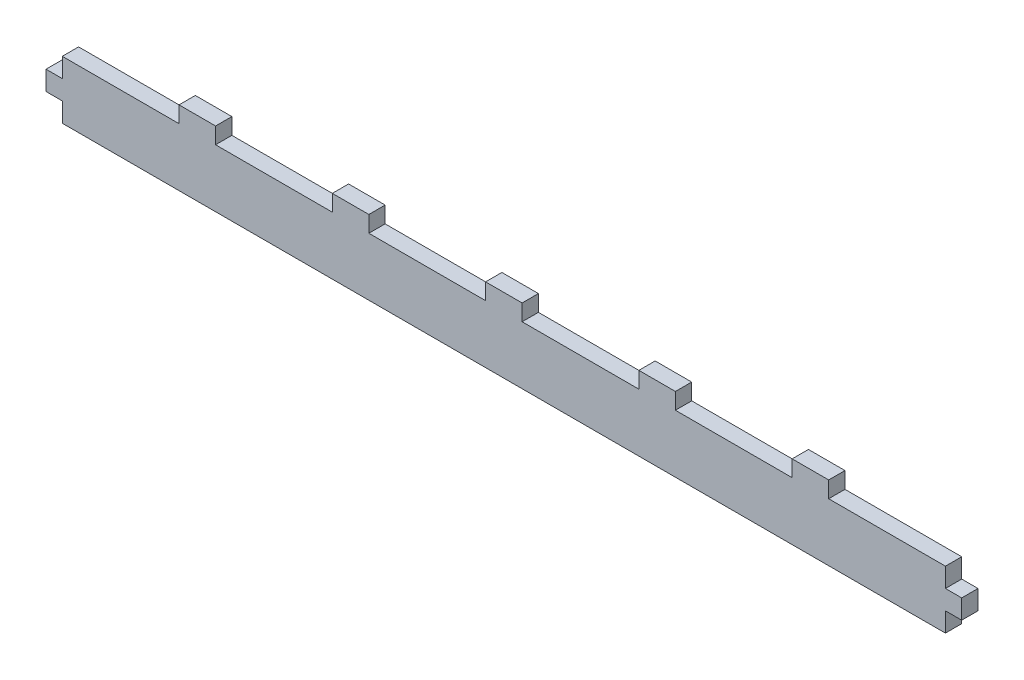
ISO-10303-21;
HEADER;
FILE_DESCRIPTION(('STEP AP214'),'2;1');
FILE_NAME('part.step','',(''),(''),'','','');
FILE_SCHEMA(('AUTOMOTIVE_DESIGN { 1 0 10303 214 1 1 1 1 }'));
ENDSEC;
DATA;
#1=APPLICATION_CONTEXT('core data for automotive mechanical design processes');
#2=APPLICATION_PROTOCOL_DEFINITION('international standard','automotive_design',2000,#1);
#3=PRODUCT_CONTEXT('',#1,'mechanical');
#4=PRODUCT('Part','Part','',(#3));
#5=PRODUCT_RELATED_PRODUCT_CATEGORY('part','',(#4));
#6=PRODUCT_DEFINITION_FORMATION('','',#4);
#7=PRODUCT_DEFINITION_CONTEXT('part definition',#1,'design');
#8=PRODUCT_DEFINITION('design','',#6,#7);
#9=PRODUCT_DEFINITION_SHAPE('','',#8);
#10=(LENGTH_UNIT() NAMED_UNIT(*) SI_UNIT(.MILLI.,.METRE.));
#11=(NAMED_UNIT(*) PLANE_ANGLE_UNIT() SI_UNIT($,.RADIAN.));
#12=(NAMED_UNIT(*) SI_UNIT($,.STERADIAN.) SOLID_ANGLE_UNIT());
#13=UNCERTAINTY_MEASURE_WITH_UNIT(LENGTH_MEASURE(1.E-05),#10,'distance_accuracy_value','');
#14=(GEOMETRIC_REPRESENTATION_CONTEXT(3) GLOBAL_UNCERTAINTY_ASSIGNED_CONTEXT((#13)) GLOBAL_UNIT_ASSIGNED_CONTEXT((#10,
#11,#12)) REPRESENTATION_CONTEXT('',''));
#15=CARTESIAN_POINT('',(0.,0.,0.));
#16=DIRECTION('',(0.,0.,1.));
#17=DIRECTION('',(1.,0.,0.));
#18=AXIS2_PLACEMENT_3D('',#15,#16,#17);
#19=CARTESIAN_POINT('',(-145.,0.,5.35));
#20=DIRECTION('',(1.,0.,0.));
#21=DIRECTION('',(0.,0.,-1.));
#22=AXIS2_PLACEMENT_3D('',#19,#20,#21);
#23=PLANE('',#22);
#24=DIRECTION('',(0.,-1.,0.));
#25=VECTOR('',#24,1.);
#26=CARTESIAN_POINT('',(-145.,0.,0.));
#27=LINE('',#26,#25);
#28=CARTESIAN_POINT('',(-145.,6.35,0.));
#29=VERTEX_POINT('',#28);
#30=CARTESIAN_POINT('',(-145.,0.,0.));
#31=VERTEX_POINT('',#30);
#32=EDGE_CURVE('E272',#29,#31,#27,.T.);
#33=ORIENTED_EDGE('',*,*,#32,.T.);
#34=DIRECTION('',(0.,0.,-1.));
#35=VECTOR('',#34,1.);
#36=CARTESIAN_POINT('',(-145.,0.,5.35));
#37=LINE('',#36,#35);
#38=CARTESIAN_POINT('',(-145.,0.,5.35));
#39=VERTEX_POINT('',#38);
#40=EDGE_CURVE('E11',#39,#31,#37,.T.);
#41=ORIENTED_EDGE('',*,*,#40,.F.);
#42=DIRECTION('',(0.,-1.,0.));
#43=VECTOR('',#42,1.);
#44=CARTESIAN_POINT('',(-145.,0.,5.35));
#45=LINE('',#44,#43);
#46=CARTESIAN_POINT('',(-145.,6.35,5.35));
#47=VERTEX_POINT('',#46);
#48=EDGE_CURVE('E334',#47,#39,#45,.T.);
#49=ORIENTED_EDGE('',*,*,#48,.F.);
#50=DIRECTION('',(0.,0.,-1.));
#51=VECTOR('',#50,1.);
#52=CARTESIAN_POINT('',(-145.,6.35,5.35));
#53=LINE('',#52,#51);
#54=EDGE_CURVE('E268',#47,#29,#53,.T.);
#55=ORIENTED_EDGE('',*,*,#54,.T.);
#56=EDGE_LOOP('',(#33,#41,#49,#55));
#57=FACE_BOUND('',#56,.T.);
#58=ADVANCED_FACE('F32',(#57),#23,.F.);
#59=CARTESIAN_POINT('',(-145.,0.,5.35));
#60=DIRECTION('',(0.,1.,0.));
#61=DIRECTION('',(-1.,0.,0.));
#62=AXIS2_PLACEMENT_3D('',#59,#60,#61);
#63=PLANE('',#62);
#64=DIRECTION('',(1.,0.,0.));
#65=VECTOR('',#64,1.);
#66=CARTESIAN_POINT('',(-145.,0.,0.));
#67=LINE('',#66,#65);
#68=CARTESIAN_POINT('',(145.,0.,0.));
#69=VERTEX_POINT('',#68);
#70=EDGE_CURVE('E275',#31,#69,#67,.T.);
#71=ORIENTED_EDGE('',*,*,#70,.T.);
#72=DIRECTION('',(0.,0.,-1.));
#73=VECTOR('',#72,1.);
#74=CARTESIAN_POINT('',(145.,0.,5.35));
#75=LINE('',#74,#73);
#76=CARTESIAN_POINT('',(145.,0.,5.35));
#77=VERTEX_POINT('',#76);
#78=EDGE_CURVE('E40',#77,#69,#75,.T.);
#79=ORIENTED_EDGE('',*,*,#78,.F.);
#80=DIRECTION('',(1.,0.,0.));
#81=VECTOR('',#80,1.);
#82=CARTESIAN_POINT('',(-145.,0.,5.35));
#83=LINE('',#82,#81);
#84=EDGE_CURVE('E163',#39,#77,#83,.T.);
#85=ORIENTED_EDGE('',*,*,#84,.F.);
#86=ORIENTED_EDGE('',*,*,#40,.T.);
#87=EDGE_LOOP('',(#71,#79,#85,#86));
#88=FACE_BOUND('',#87,.T.);
#89=ADVANCED_FACE('F512',(#88),#63,.F.);
#90=CARTESIAN_POINT('',(145.,0.,5.35));
#91=DIRECTION('',(-1.,0.,0.));
#92=DIRECTION('',(0.,-1.,0.));
#93=AXIS2_PLACEMENT_3D('',#90,#91,#92);
#94=PLANE('',#93);
#95=DIRECTION('',(0.,1.,0.));
#96=VECTOR('',#95,1.);
#97=CARTESIAN_POINT('',(145.,0.,0.));
#98=LINE('',#97,#96);
#99=CARTESIAN_POINT('',(145.,6.35,0.));
#100=VERTEX_POINT('',#99);
#101=EDGE_CURVE('E277',#69,#100,#98,.T.);
#102=ORIENTED_EDGE('',*,*,#101,.T.);
#103=DIRECTION('',(0.,0.,-1.));
#104=VECTOR('',#103,1.);
#105=CARTESIAN_POINT('',(145.,6.35,5.35));
#106=LINE('',#105,#104);
#107=CARTESIAN_POINT('',(145.,6.35,5.35));
#108=VERTEX_POINT('',#107);
#109=EDGE_CURVE('E413',#108,#100,#106,.T.);
#110=ORIENTED_EDGE('',*,*,#109,.F.);
#111=DIRECTION('',(0.,1.,0.));
#112=VECTOR('',#111,1.);
#113=CARTESIAN_POINT('',(145.,0.,5.35));
#114=LINE('',#113,#112);
#115=EDGE_CURVE('E421',#77,#108,#114,.T.);
#116=ORIENTED_EDGE('',*,*,#115,.F.);
#117=ORIENTED_EDGE('',*,*,#78,.T.);
#118=EDGE_LOOP('',(#102,#110,#116,#117));
#119=FACE_BOUND('',#118,.T.);
#120=ADVANCED_FACE('F419',(#119),#94,.F.);
#121=CARTESIAN_POINT('',(145.,6.35,5.35));
#122=DIRECTION('',(0.,1.,0.));
#123=DIRECTION('',(0.,0.,1.));
#124=AXIS2_PLACEMENT_3D('',#121,#122,#123);
#125=PLANE('',#124);
#126=DIRECTION('',(1.,0.,0.));
#127=VECTOR('',#126,1.);
#128=CARTESIAN_POINT('',(145.,6.35,0.));
#129=LINE('',#128,#127);
#130=CARTESIAN_POINT('',(150.35,6.35,0.));
#131=VERTEX_POINT('',#130);
#132=EDGE_CURVE('E279',#100,#131,#129,.T.);
#133=ORIENTED_EDGE('',*,*,#132,.T.);
#134=DIRECTION('',(0.,0.,-1.));
#135=VECTOR('',#134,1.);
#136=CARTESIAN_POINT('',(150.35,6.35,5.35));
#137=LINE('',#136,#135);
#138=CARTESIAN_POINT('',(150.35,6.35,5.35));
#139=VERTEX_POINT('',#138);
#140=EDGE_CURVE('E410',#139,#131,#137,.T.);
#141=ORIENTED_EDGE('',*,*,#140,.F.);
#142=DIRECTION('',(1.,0.,0.));
#143=VECTOR('',#142,1.);
#144=CARTESIAN_POINT('',(145.,6.35,5.35));
#145=LINE('',#144,#143);
#146=EDGE_CURVE('E439',#108,#139,#145,.T.);
#147=ORIENTED_EDGE('',*,*,#146,.F.);
#148=ORIENTED_EDGE('',*,*,#109,.T.);
#149=EDGE_LOOP('',(#133,#141,#147,#148));
#150=FACE_BOUND('',#149,.T.);
#151=ADVANCED_FACE('F430',(#150),#125,.F.);
#152=CARTESIAN_POINT('',(150.35,6.35,5.35));
#153=DIRECTION('',(-1.,0.,0.));
#154=DIRECTION('',(0.,0.,1.));
#155=AXIS2_PLACEMENT_3D('',#152,#153,#154);
#156=PLANE('',#155);
#157=DIRECTION('',(0.,1.,0.));
#158=VECTOR('',#157,1.);
#159=CARTESIAN_POINT('',(150.35,6.35,0.));
#160=LINE('',#159,#158);
#161=CARTESIAN_POINT('',(150.35,12.7,0.));
#162=VERTEX_POINT('',#161);
#163=EDGE_CURVE('E281',#131,#162,#160,.T.);
#164=ORIENTED_EDGE('',*,*,#163,.T.);
#165=DIRECTION('',(0.,0.,-1.));
#166=VECTOR('',#165,1.);
#167=CARTESIAN_POINT('',(150.35,12.7,5.35));
#168=LINE('',#167,#166);
#169=CARTESIAN_POINT('',(150.35,12.7,5.35));
#170=VERTEX_POINT('',#169);
#171=EDGE_CURVE('E407',#170,#162,#168,.T.);
#172=ORIENTED_EDGE('',*,*,#171,.F.);
#173=DIRECTION('',(0.,1.,0.));
#174=VECTOR('',#173,1.);
#175=CARTESIAN_POINT('',(150.35,6.35,5.35));
#176=LINE('',#175,#174);
#177=EDGE_CURVE('E436',#139,#170,#176,.T.);
#178=ORIENTED_EDGE('',*,*,#177,.F.);
#179=ORIENTED_EDGE('',*,*,#140,.T.);
#180=EDGE_LOOP('',(#164,#172,#178,#179));
#181=FACE_BOUND('',#180,.T.);
#182=ADVANCED_FACE('F434',(#181),#156,.F.);
#183=CARTESIAN_POINT('',(145.,12.7,5.35));
#184=DIRECTION('',(0.,-1.,0.));
#185=DIRECTION('',(1.,0.,0.));
#186=AXIS2_PLACEMENT_3D('',#183,#184,#185);
#187=PLANE('',#186);
#188=DIRECTION('',(-1.,0.,0.));
#189=VECTOR('',#188,1.);
#190=CARTESIAN_POINT('',(145.,12.7,0.));
#191=LINE('',#190,#189);
#192=CARTESIAN_POINT('',(145.,12.7,0.));
#193=VERTEX_POINT('',#192);
#194=EDGE_CURVE('E283',#162,#193,#191,.T.);
#195=ORIENTED_EDGE('',*,*,#194,.T.);
#196=DIRECTION('',(0.,0.,-1.));
#197=VECTOR('',#196,1.);
#198=CARTESIAN_POINT('',(145.,12.7,5.35));
#199=LINE('',#198,#197);
#200=CARTESIAN_POINT('',(145.,12.7,5.35));
#201=VERTEX_POINT('',#200);
#202=EDGE_CURVE('E404',#201,#193,#199,.T.);
#203=ORIENTED_EDGE('',*,*,#202,.F.);
#204=DIRECTION('',(-1.,0.,0.));
#205=VECTOR('',#204,1.);
#206=CARTESIAN_POINT('',(145.,12.7,5.35));
#207=LINE('',#206,#205);
#208=EDGE_CURVE('E438',#170,#201,#207,.T.);
#209=ORIENTED_EDGE('',*,*,#208,.F.);
#210=ORIENTED_EDGE('',*,*,#171,.T.);
#211=EDGE_LOOP('',(#195,#203,#209,#210));
#212=FACE_BOUND('',#211,.T.);
#213=ADVANCED_FACE('F525',(#212),#187,.F.);
#214=CARTESIAN_POINT('',(145.,12.7,5.35));
#215=DIRECTION('',(-1.,0.,0.));
#216=DIRECTION('',(0.,-1.,0.));
#217=AXIS2_PLACEMENT_3D('',#214,#215,#216);
#218=PLANE('',#217);
#219=DIRECTION('',(0.,1.,0.));
#220=VECTOR('',#219,1.);
#221=CARTESIAN_POINT('',(145.,12.7,0.));
#222=LINE('',#221,#220);
#223=CARTESIAN_POINT('',(145.,19.05,0.));
#224=VERTEX_POINT('',#223);
#225=EDGE_CURVE('E285',#193,#224,#222,.T.);
#226=ORIENTED_EDGE('',*,*,#225,.T.);
#227=DIRECTION('',(0.,0.,-1.));
#228=VECTOR('',#227,1.);
#229=CARTESIAN_POINT('',(145.,19.05,5.35));
#230=LINE('',#229,#228);
#231=CARTESIAN_POINT('',(145.,19.05,5.35));
#232=VERTEX_POINT('',#231);
#233=EDGE_CURVE('E401',#232,#224,#230,.T.);
#234=ORIENTED_EDGE('',*,*,#233,.F.);
#235=DIRECTION('',(0.,1.,0.));
#236=VECTOR('',#235,1.);
#237=CARTESIAN_POINT('',(145.,12.7,5.35));
#238=LINE('',#237,#236);
#239=EDGE_CURVE('E441',#201,#232,#238,.T.);
#240=ORIENTED_EDGE('',*,*,#239,.F.);
#241=ORIENTED_EDGE('',*,*,#202,.T.);
#242=EDGE_LOOP('',(#226,#234,#240,#241));
#243=FACE_BOUND('',#242,.T.);
#244=ADVANCED_FACE('F528',(#243),#218,.F.);
#245=CARTESIAN_POINT('',(106.666,19.05,5.35));
#246=DIRECTION('',(0.,-1.,0.));
#247=DIRECTION('',(1.,0.,0.));
#248=AXIS2_PLACEMENT_3D('',#245,#246,#247);
#249=PLANE('',#248);
#250=DIRECTION('',(-1.,0.,0.));
#251=VECTOR('',#250,1.);
#252=CARTESIAN_POINT('',(106.666,19.05,0.));
#253=LINE('',#252,#251);
#254=CARTESIAN_POINT('',(106.666,19.05,0.));
#255=VERTEX_POINT('',#254);
#256=EDGE_CURVE('E287',#224,#255,#253,.T.);
#257=ORIENTED_EDGE('',*,*,#256,.T.);
#258=DIRECTION('',(0.,0.,-1.));
#259=VECTOR('',#258,1.);
#260=CARTESIAN_POINT('',(106.666,19.05,5.35));
#261=LINE('',#260,#259);
#262=CARTESIAN_POINT('',(106.666,19.05,5.35));
#263=VERTEX_POINT('',#262);
#264=EDGE_CURVE('E398',#263,#255,#261,.T.);
#265=ORIENTED_EDGE('',*,*,#264,.F.);
#266=DIRECTION('',(-1.,0.,0.));
#267=VECTOR('',#266,1.);
#268=CARTESIAN_POINT('',(106.666,19.05,5.35));
#269=LINE('',#268,#267);
#270=EDGE_CURVE('E447',#232,#263,#269,.T.);
#271=ORIENTED_EDGE('',*,*,#270,.F.);
#272=ORIENTED_EDGE('',*,*,#233,.T.);
#273=EDGE_LOOP('',(#257,#265,#271,#272));
#274=FACE_BOUND('',#273,.T.);
#275=ADVANCED_FACE('F532',(#274),#249,.F.);
#276=CARTESIAN_POINT('',(106.666,24.4,5.35));
#277=DIRECTION('',(-1.,0.,0.));
#278=DIRECTION('',(0.,0.,1.));
#279=AXIS2_PLACEMENT_3D('',#276,#277,#278);
#280=PLANE('',#279);
#281=DIRECTION('',(0.,1.,0.));
#282=VECTOR('',#281,1.);
#283=CARTESIAN_POINT('',(106.666,24.4,0.));
#284=LINE('',#283,#282);
#285=CARTESIAN_POINT('',(106.666,24.4,0.));
#286=VERTEX_POINT('',#285);
#287=EDGE_CURVE('E289',#255,#286,#284,.T.);
#288=ORIENTED_EDGE('',*,*,#287,.T.);
#289=DIRECTION('',(0.,0.,-1.));
#290=VECTOR('',#289,1.);
#291=CARTESIAN_POINT('',(106.666,24.4,5.35));
#292=LINE('',#291,#290);
#293=CARTESIAN_POINT('',(106.666,24.4,5.35));
#294=VERTEX_POINT('',#293);
#295=EDGE_CURVE('E395',#294,#286,#292,.T.);
#296=ORIENTED_EDGE('',*,*,#295,.F.);
#297=DIRECTION('',(0.,1.,0.));
#298=VECTOR('',#297,1.);
#299=CARTESIAN_POINT('',(106.666,24.4,5.35));
#300=LINE('',#299,#298);
#301=EDGE_CURVE('E449',#263,#294,#300,.T.);
#302=ORIENTED_EDGE('',*,*,#301,.F.);
#303=ORIENTED_EDGE('',*,*,#264,.T.);
#304=EDGE_LOOP('',(#288,#296,#302,#303));
#305=FACE_BOUND('',#304,.T.);
#306=ADVANCED_FACE('F536',(#305),#280,.F.);
#307=CARTESIAN_POINT('',(106.666,24.4,5.35));
#308=DIRECTION('',(0.,-1.,0.));
#309=DIRECTION('',(0.,0.,-1.));
#310=AXIS2_PLACEMENT_3D('',#307,#308,#309);
#311=PLANE('',#310);
#312=DIRECTION('',(-1.,0.,0.));
#313=VECTOR('',#312,1.);
#314=CARTESIAN_POINT('',(106.666,24.4,0.));
#315=LINE('',#314,#313);
#316=CARTESIAN_POINT('',(94.666,24.4,0.));
#317=VERTEX_POINT('',#316);
#318=EDGE_CURVE('E291',#286,#317,#315,.T.);
#319=ORIENTED_EDGE('',*,*,#318,.T.);
#320=DIRECTION('',(0.,0.,-1.));
#321=VECTOR('',#320,1.);
#322=CARTESIAN_POINT('',(94.666,24.4,5.35));
#323=LINE('',#322,#321);
#324=CARTESIAN_POINT('',(94.666,24.4,5.35));
#325=VERTEX_POINT('',#324);
#326=EDGE_CURVE('E392',#325,#317,#323,.T.);
#327=ORIENTED_EDGE('',*,*,#326,.F.);
#328=DIRECTION('',(-1.,0.,0.));
#329=VECTOR('',#328,1.);
#330=CARTESIAN_POINT('',(106.666,24.4,5.35));
#331=LINE('',#330,#329);
#332=EDGE_CURVE('E451',#294,#325,#331,.T.);
#333=ORIENTED_EDGE('',*,*,#332,.F.);
#334=ORIENTED_EDGE('',*,*,#295,.T.);
#335=EDGE_LOOP('',(#319,#327,#333,#334));
#336=FACE_BOUND('',#335,.T.);
#337=ADVANCED_FACE('F540',(#336),#311,.F.);
#338=CARTESIAN_POINT('',(94.666,24.4,5.35));
#339=DIRECTION('',(1.,0.,0.));
#340=DIRECTION('',(0.,0.,-1.));
#341=AXIS2_PLACEMENT_3D('',#338,#339,#340);
#342=PLANE('',#341);
#343=DIRECTION('',(0.,-1.,0.));
#344=VECTOR('',#343,1.);
#345=CARTESIAN_POINT('',(94.666,24.4,0.));
#346=LINE('',#345,#344);
#347=CARTESIAN_POINT('',(94.666,19.05,0.));
#348=VERTEX_POINT('',#347);
#349=EDGE_CURVE('E293',#317,#348,#346,.T.);
#350=ORIENTED_EDGE('',*,*,#349,.T.);
#351=DIRECTION('',(0.,0.,-1.));
#352=VECTOR('',#351,1.);
#353=CARTESIAN_POINT('',(94.666,19.05,5.35));
#354=LINE('',#353,#352);
#355=CARTESIAN_POINT('',(94.666,19.05,5.35));
#356=VERTEX_POINT('',#355);
#357=EDGE_CURVE('E389',#356,#348,#354,.T.);
#358=ORIENTED_EDGE('',*,*,#357,.F.);
#359=DIRECTION('',(0.,-1.,0.));
#360=VECTOR('',#359,1.);
#361=CARTESIAN_POINT('',(94.666,24.4,5.35));
#362=LINE('',#361,#360);
#363=EDGE_CURVE('E453',#325,#356,#362,.T.);
#364=ORIENTED_EDGE('',*,*,#363,.F.);
#365=ORIENTED_EDGE('',*,*,#326,.T.);
#366=EDGE_LOOP('',(#350,#358,#364,#365));
#367=FACE_BOUND('',#366,.T.);
#368=ADVANCED_FACE('F544',(#367),#342,.F.);
#369=CARTESIAN_POINT('',(56.333,19.05,5.35));
#370=DIRECTION('',(0.,-1.,0.));
#371=DIRECTION('',(0.,0.,-1.));
#372=AXIS2_PLACEMENT_3D('',#369,#370,#371);
#373=PLANE('',#372);
#374=DIRECTION('',(-1.,0.,0.));
#375=VECTOR('',#374,1.);
#376=CARTESIAN_POINT('',(56.333,19.05,0.));
#377=LINE('',#376,#375);
#378=CARTESIAN_POINT('',(56.333,19.05,0.));
#379=VERTEX_POINT('',#378);
#380=EDGE_CURVE('E295',#348,#379,#377,.T.);
#381=ORIENTED_EDGE('',*,*,#380,.T.);
#382=DIRECTION('',(0.,0.,-1.));
#383=VECTOR('',#382,1.);
#384=CARTESIAN_POINT('',(56.333,19.05,5.35));
#385=LINE('',#384,#383);
#386=CARTESIAN_POINT('',(56.333,19.05,5.35));
#387=VERTEX_POINT('',#386);
#388=EDGE_CURVE('E386',#387,#379,#385,.T.);
#389=ORIENTED_EDGE('',*,*,#388,.F.);
#390=DIRECTION('',(-1.,0.,0.));
#391=VECTOR('',#390,1.);
#392=CARTESIAN_POINT('',(56.333,19.05,5.35));
#393=LINE('',#392,#391);
#394=EDGE_CURVE('E455',#356,#387,#393,.T.);
#395=ORIENTED_EDGE('',*,*,#394,.F.);
#396=ORIENTED_EDGE('',*,*,#357,.T.);
#397=EDGE_LOOP('',(#381,#389,#395,#396));
#398=FACE_BOUND('',#397,.T.);
#399=ADVANCED_FACE('F548',(#398),#373,.F.);
#400=CARTESIAN_POINT('',(56.333,24.4,5.35));
#401=DIRECTION('',(-1.,0.,0.));
#402=DIRECTION('',(0.,0.,1.));
#403=AXIS2_PLACEMENT_3D('',#400,#401,#402);
#404=PLANE('',#403);
#405=DIRECTION('',(0.,1.,0.));
#406=VECTOR('',#405,1.);
#407=CARTESIAN_POINT('',(56.333,24.4,0.));
#408=LINE('',#407,#406);
#409=CARTESIAN_POINT('',(56.333,24.4,0.));
#410=VERTEX_POINT('',#409);
#411=EDGE_CURVE('E297',#379,#410,#408,.T.);
#412=ORIENTED_EDGE('',*,*,#411,.T.);
#413=DIRECTION('',(0.,0.,-1.));
#414=VECTOR('',#413,1.);
#415=CARTESIAN_POINT('',(56.333,24.4,5.35));
#416=LINE('',#415,#414);
#417=CARTESIAN_POINT('',(56.333,24.4,5.35));
#418=VERTEX_POINT('',#417);
#419=EDGE_CURVE('E383',#418,#410,#416,.T.);
#420=ORIENTED_EDGE('',*,*,#419,.F.);
#421=DIRECTION('',(0.,1.,0.));
#422=VECTOR('',#421,1.);
#423=CARTESIAN_POINT('',(56.333,24.4,5.35));
#424=LINE('',#423,#422);
#425=EDGE_CURVE('E457',#387,#418,#424,.T.);
#426=ORIENTED_EDGE('',*,*,#425,.F.);
#427=ORIENTED_EDGE('',*,*,#388,.T.);
#428=EDGE_LOOP('',(#412,#420,#426,#427));
#429=FACE_BOUND('',#428,.T.);
#430=ADVANCED_FACE('F552',(#429),#404,.F.);
#431=CARTESIAN_POINT('',(56.333,24.4,5.35));
#432=DIRECTION('',(0.,-1.,0.));
#433=DIRECTION('',(0.,0.,-1.));
#434=AXIS2_PLACEMENT_3D('',#431,#432,#433);
#435=PLANE('',#434);
#436=DIRECTION('',(-1.,0.,0.));
#437=VECTOR('',#436,1.);
#438=CARTESIAN_POINT('',(56.333,24.4,0.));
#439=LINE('',#438,#437);
#440=CARTESIAN_POINT('',(44.333,24.4,0.));
#441=VERTEX_POINT('',#440);
#442=EDGE_CURVE('E299',#410,#441,#439,.T.);
#443=ORIENTED_EDGE('',*,*,#442,.T.);
#444=DIRECTION('',(0.,0.,-1.));
#445=VECTOR('',#444,1.);
#446=CARTESIAN_POINT('',(44.333,24.4,5.35));
#447=LINE('',#446,#445);
#448=CARTESIAN_POINT('',(44.333,24.4,5.35));
#449=VERTEX_POINT('',#448);
#450=EDGE_CURVE('E380',#449,#441,#447,.T.);
#451=ORIENTED_EDGE('',*,*,#450,.F.);
#452=DIRECTION('',(-1.,0.,0.));
#453=VECTOR('',#452,1.);
#454=CARTESIAN_POINT('',(56.333,24.4,5.35));
#455=LINE('',#454,#453);
#456=EDGE_CURVE('E459',#418,#449,#455,.T.);
#457=ORIENTED_EDGE('',*,*,#456,.F.);
#458=ORIENTED_EDGE('',*,*,#419,.T.);
#459=EDGE_LOOP('',(#443,#451,#457,#458));
#460=FACE_BOUND('',#459,.T.);
#461=ADVANCED_FACE('F556',(#460),#435,.F.);
#462=CARTESIAN_POINT('',(44.333,24.4,5.35));
#463=DIRECTION('',(1.,0.,0.));
#464=DIRECTION('',(0.,1.,0.));
#465=AXIS2_PLACEMENT_3D('',#462,#463,#464);
#466=PLANE('',#465);
#467=DIRECTION('',(0.,-1.,0.));
#468=VECTOR('',#467,1.);
#469=CARTESIAN_POINT('',(44.333,24.4,0.));
#470=LINE('',#469,#468);
#471=CARTESIAN_POINT('',(44.333,19.05,0.));
#472=VERTEX_POINT('',#471);
#473=EDGE_CURVE('E301',#441,#472,#470,.T.);
#474=ORIENTED_EDGE('',*,*,#473,.T.);
#475=DIRECTION('',(0.,0.,-1.));
#476=VECTOR('',#475,1.);
#477=CARTESIAN_POINT('',(44.333,19.05,5.35));
#478=LINE('',#477,#476);
#479=CARTESIAN_POINT('',(44.333,19.05,5.35));
#480=VERTEX_POINT('',#479);
#481=EDGE_CURVE('E377',#480,#472,#478,.T.);
#482=ORIENTED_EDGE('',*,*,#481,.F.);
#483=DIRECTION('',(0.,-1.,0.));
#484=VECTOR('',#483,1.);
#485=CARTESIAN_POINT('',(44.333,24.4,5.35));
#486=LINE('',#485,#484);
#487=EDGE_CURVE('E461',#449,#480,#486,.T.);
#488=ORIENTED_EDGE('',*,*,#487,.F.);
#489=ORIENTED_EDGE('',*,*,#450,.T.);
#490=EDGE_LOOP('',(#474,#482,#488,#489));
#491=FACE_BOUND('',#490,.T.);
#492=ADVANCED_FACE('F560',(#491),#466,.F.);
#493=CARTESIAN_POINT('',(6.,19.05,5.35));
#494=DIRECTION('',(0.,-1.,0.));
#495=DIRECTION('',(0.,0.,-1.));
#496=AXIS2_PLACEMENT_3D('',#493,#494,#495);
#497=PLANE('',#496);
#498=DIRECTION('',(-1.,0.,0.));
#499=VECTOR('',#498,1.);
#500=CARTESIAN_POINT('',(6.,19.05,0.));
#501=LINE('',#500,#499);
#502=CARTESIAN_POINT('',(6.,19.05,0.));
#503=VERTEX_POINT('',#502);
#504=EDGE_CURVE('E303',#472,#503,#501,.T.);
#505=ORIENTED_EDGE('',*,*,#504,.T.);
#506=DIRECTION('',(0.,0.,-1.));
#507=VECTOR('',#506,1.);
#508=CARTESIAN_POINT('',(6.,19.05,5.35));
#509=LINE('',#508,#507);
#510=CARTESIAN_POINT('',(6.,19.05,5.35));
#511=VERTEX_POINT('',#510);
#512=EDGE_CURVE('E374',#511,#503,#509,.T.);
#513=ORIENTED_EDGE('',*,*,#512,.F.);
#514=DIRECTION('',(-1.,0.,0.));
#515=VECTOR('',#514,1.);
#516=CARTESIAN_POINT('',(6.,19.05,5.35));
#517=LINE('',#516,#515);
#518=EDGE_CURVE('E463',#480,#511,#517,.T.);
#519=ORIENTED_EDGE('',*,*,#518,.F.);
#520=ORIENTED_EDGE('',*,*,#481,.T.);
#521=EDGE_LOOP('',(#505,#513,#519,#520));
#522=FACE_BOUND('',#521,.T.);
#523=ADVANCED_FACE('F564',(#522),#497,.F.);
#524=CARTESIAN_POINT('',(6.,24.4,5.35));
#525=DIRECTION('',(-1.,0.,0.));
#526=DIRECTION('',(0.,-1.,0.));
#527=AXIS2_PLACEMENT_3D('',#524,#525,#526);
#528=PLANE('',#527);
#529=DIRECTION('',(0.,1.,0.));
#530=VECTOR('',#529,1.);
#531=CARTESIAN_POINT('',(6.,24.4,0.));
#532=LINE('',#531,#530);
#533=CARTESIAN_POINT('',(6.,24.4,0.));
#534=VERTEX_POINT('',#533);
#535=EDGE_CURVE('E305',#503,#534,#532,.T.);
#536=ORIENTED_EDGE('',*,*,#535,.T.);
#537=DIRECTION('',(0.,0.,-1.));
#538=VECTOR('',#537,1.);
#539=CARTESIAN_POINT('',(6.,24.4,5.35));
#540=LINE('',#539,#538);
#541=CARTESIAN_POINT('',(6.,24.4,5.35));
#542=VERTEX_POINT('',#541);
#543=EDGE_CURVE('E371',#542,#534,#540,.T.);
#544=ORIENTED_EDGE('',*,*,#543,.F.);
#545=DIRECTION('',(0.,1.,0.));
#546=VECTOR('',#545,1.);
#547=CARTESIAN_POINT('',(6.,24.4,5.35));
#548=LINE('',#547,#546);
#549=EDGE_CURVE('E465',#511,#542,#548,.T.);
#550=ORIENTED_EDGE('',*,*,#549,.F.);
#551=ORIENTED_EDGE('',*,*,#512,.T.);
#552=EDGE_LOOP('',(#536,#544,#550,#551));
#553=FACE_BOUND('',#552,.T.);
#554=ADVANCED_FACE('F568',(#553),#528,.F.);
#555=CARTESIAN_POINT('',(6.,24.4,5.35));
#556=DIRECTION('',(0.,-1.,0.));
#557=DIRECTION('',(0.,0.,-1.));
#558=AXIS2_PLACEMENT_3D('',#555,#556,#557);
#559=PLANE('',#558);
#560=DIRECTION('',(-1.,0.,0.));
#561=VECTOR('',#560,1.);
#562=CARTESIAN_POINT('',(6.,24.4,0.));
#563=LINE('',#562,#561);
#564=CARTESIAN_POINT('',(-6.,24.4,0.));
#565=VERTEX_POINT('',#564);
#566=EDGE_CURVE('E307',#534,#565,#563,.T.);
#567=ORIENTED_EDGE('',*,*,#566,.T.);
#568=DIRECTION('',(0.,0.,-1.));
#569=VECTOR('',#568,1.);
#570=CARTESIAN_POINT('',(-6.,24.4,5.35));
#571=LINE('',#570,#569);
#572=CARTESIAN_POINT('',(-6.,24.4,5.35));
#573=VERTEX_POINT('',#572);
#574=EDGE_CURVE('E368',#573,#565,#571,.T.);
#575=ORIENTED_EDGE('',*,*,#574,.F.);
#576=DIRECTION('',(-1.,0.,0.));
#577=VECTOR('',#576,1.);
#578=CARTESIAN_POINT('',(6.,24.4,5.35));
#579=LINE('',#578,#577);
#580=EDGE_CURVE('E467',#542,#573,#579,.T.);
#581=ORIENTED_EDGE('',*,*,#580,.F.);
#582=ORIENTED_EDGE('',*,*,#543,.T.);
#583=EDGE_LOOP('',(#567,#575,#581,#582));
#584=FACE_BOUND('',#583,.T.);
#585=ADVANCED_FACE('F572',(#584),#559,.F.);
#586=CARTESIAN_POINT('',(-6.,24.4,5.35));
#587=DIRECTION('',(1.,0.,0.));
#588=DIRECTION('',(0.,1.,0.));
#589=AXIS2_PLACEMENT_3D('',#586,#587,#588);
#590=PLANE('',#589);
#591=DIRECTION('',(0.,-1.,0.));
#592=VECTOR('',#591,1.);
#593=CARTESIAN_POINT('',(-6.,24.4,0.));
#594=LINE('',#593,#592);
#595=CARTESIAN_POINT('',(-6.,19.05,0.));
#596=VERTEX_POINT('',#595);
#597=EDGE_CURVE('E309',#565,#596,#594,.T.);
#598=ORIENTED_EDGE('',*,*,#597,.T.);
#599=DIRECTION('',(0.,0.,-1.));
#600=VECTOR('',#599,1.);
#601=CARTESIAN_POINT('',(-6.,19.05,5.35));
#602=LINE('',#601,#600);
#603=CARTESIAN_POINT('',(-6.,19.05,5.35));
#604=VERTEX_POINT('',#603);
#605=EDGE_CURVE('E365',#604,#596,#602,.T.);
#606=ORIENTED_EDGE('',*,*,#605,.F.);
#607=DIRECTION('',(0.,-1.,0.));
#608=VECTOR('',#607,1.);
#609=CARTESIAN_POINT('',(-6.,24.4,5.35));
#610=LINE('',#609,#608);
#611=EDGE_CURVE('E469',#573,#604,#610,.T.);
#612=ORIENTED_EDGE('',*,*,#611,.F.);
#613=ORIENTED_EDGE('',*,*,#574,.T.);
#614=EDGE_LOOP('',(#598,#606,#612,#613));
#615=FACE_BOUND('',#614,.T.);
#616=ADVANCED_FACE('F576',(#615),#590,.F.);
#617=CARTESIAN_POINT('',(-44.333,19.05,5.35));
#618=DIRECTION('',(0.,-1.,0.));
#619=DIRECTION('',(1.,0.,0.));
#620=AXIS2_PLACEMENT_3D('',#617,#618,#619);
#621=PLANE('',#620);
#622=DIRECTION('',(-1.,0.,0.));
#623=VECTOR('',#622,1.);
#624=CARTESIAN_POINT('',(-44.333,19.05,0.));
#625=LINE('',#624,#623);
#626=CARTESIAN_POINT('',(-44.333,19.05,0.));
#627=VERTEX_POINT('',#626);
#628=EDGE_CURVE('E311',#596,#627,#625,.T.);
#629=ORIENTED_EDGE('',*,*,#628,.T.);
#630=DIRECTION('',(0.,0.,-1.));
#631=VECTOR('',#630,1.);
#632=CARTESIAN_POINT('',(-44.333,19.05,5.35));
#633=LINE('',#632,#631);
#634=CARTESIAN_POINT('',(-44.333,19.05,5.35));
#635=VERTEX_POINT('',#634);
#636=EDGE_CURVE('E362',#635,#627,#633,.T.);
#637=ORIENTED_EDGE('',*,*,#636,.F.);
#638=DIRECTION('',(-1.,0.,0.));
#639=VECTOR('',#638,1.);
#640=CARTESIAN_POINT('',(-44.333,19.05,5.35));
#641=LINE('',#640,#639);
#642=EDGE_CURVE('E471',#604,#635,#641,.T.);
#643=ORIENTED_EDGE('',*,*,#642,.F.);
#644=ORIENTED_EDGE('',*,*,#605,.T.);
#645=EDGE_LOOP('',(#629,#637,#643,#644));
#646=FACE_BOUND('',#645,.T.);
#647=ADVANCED_FACE('F580',(#646),#621,.F.);
#648=CARTESIAN_POINT('',(-44.333,24.4,5.35));
#649=DIRECTION('',(-1.,0.,0.));
#650=DIRECTION('',(0.,0.,1.));
#651=AXIS2_PLACEMENT_3D('',#648,#649,#650);
#652=PLANE('',#651);
#653=DIRECTION('',(0.,1.,0.));
#654=VECTOR('',#653,1.);
#655=CARTESIAN_POINT('',(-44.333,24.4,0.));
#656=LINE('',#655,#654);
#657=CARTESIAN_POINT('',(-44.333,24.4,0.));
#658=VERTEX_POINT('',#657);
#659=EDGE_CURVE('E313',#627,#658,#656,.T.);
#660=ORIENTED_EDGE('',*,*,#659,.T.);
#661=DIRECTION('',(0.,0.,-1.));
#662=VECTOR('',#661,1.);
#663=CARTESIAN_POINT('',(-44.333,24.4,5.35));
#664=LINE('',#663,#662);
#665=CARTESIAN_POINT('',(-44.333,24.4,5.35));
#666=VERTEX_POINT('',#665);
#667=EDGE_CURVE('E359',#666,#658,#664,.T.);
#668=ORIENTED_EDGE('',*,*,#667,.F.);
#669=DIRECTION('',(0.,1.,0.));
#670=VECTOR('',#669,1.);
#671=CARTESIAN_POINT('',(-44.333,24.4,5.35));
#672=LINE('',#671,#670);
#673=EDGE_CURVE('E473',#635,#666,#672,.T.);
#674=ORIENTED_EDGE('',*,*,#673,.F.);
#675=ORIENTED_EDGE('',*,*,#636,.T.);
#676=EDGE_LOOP('',(#660,#668,#674,#675));
#677=FACE_BOUND('',#676,.T.);
#678=ADVANCED_FACE('F584',(#677),#652,.F.);
#679=CARTESIAN_POINT('',(-44.333,24.4,5.35));
#680=DIRECTION('',(0.,-1.,0.));
#681=DIRECTION('',(0.,0.,-1.));
#682=AXIS2_PLACEMENT_3D('',#679,#680,#681);
#683=PLANE('',#682);
#684=DIRECTION('',(-1.,0.,0.));
#685=VECTOR('',#684,1.);
#686=CARTESIAN_POINT('',(-44.333,24.4,0.));
#687=LINE('',#686,#685);
#688=CARTESIAN_POINT('',(-56.333,24.4,0.));
#689=VERTEX_POINT('',#688);
#690=EDGE_CURVE('E315',#658,#689,#687,.T.);
#691=ORIENTED_EDGE('',*,*,#690,.T.);
#692=DIRECTION('',(0.,0.,-1.));
#693=VECTOR('',#692,1.);
#694=CARTESIAN_POINT('',(-56.333,24.4,5.35));
#695=LINE('',#694,#693);
#696=CARTESIAN_POINT('',(-56.333,24.4,5.35));
#697=VERTEX_POINT('',#696);
#698=EDGE_CURVE('E356',#697,#689,#695,.T.);
#699=ORIENTED_EDGE('',*,*,#698,.F.);
#700=DIRECTION('',(-1.,0.,0.));
#701=VECTOR('',#700,1.);
#702=CARTESIAN_POINT('',(-44.333,24.4,5.35));
#703=LINE('',#702,#701);
#704=EDGE_CURVE('E475',#666,#697,#703,.T.);
#705=ORIENTED_EDGE('',*,*,#704,.F.);
#706=ORIENTED_EDGE('',*,*,#667,.T.);
#707=EDGE_LOOP('',(#691,#699,#705,#706));
#708=FACE_BOUND('',#707,.T.);
#709=ADVANCED_FACE('F588',(#708),#683,.F.);
#710=CARTESIAN_POINT('',(-56.333,24.4,5.35));
#711=DIRECTION('',(1.,0.,0.));
#712=DIRECTION('',(0.,0.,-1.));
#713=AXIS2_PLACEMENT_3D('',#710,#711,#712);
#714=PLANE('',#713);
#715=DIRECTION('',(0.,-1.,0.));
#716=VECTOR('',#715,1.);
#717=CARTESIAN_POINT('',(-56.333,24.4,0.));
#718=LINE('',#717,#716);
#719=CARTESIAN_POINT('',(-56.333,19.05,0.));
#720=VERTEX_POINT('',#719);
#721=EDGE_CURVE('E317',#689,#720,#718,.T.);
#722=ORIENTED_EDGE('',*,*,#721,.T.);
#723=DIRECTION('',(0.,0.,-1.));
#724=VECTOR('',#723,1.);
#725=CARTESIAN_POINT('',(-56.333,19.05,5.35));
#726=LINE('',#725,#724);
#727=CARTESIAN_POINT('',(-56.333,19.05,5.35));
#728=VERTEX_POINT('',#727);
#729=EDGE_CURVE('E353',#728,#720,#726,.T.);
#730=ORIENTED_EDGE('',*,*,#729,.F.);
#731=DIRECTION('',(0.,-1.,0.));
#732=VECTOR('',#731,1.);
#733=CARTESIAN_POINT('',(-56.333,24.4,5.35));
#734=LINE('',#733,#732);
#735=EDGE_CURVE('E477',#697,#728,#734,.T.);
#736=ORIENTED_EDGE('',*,*,#735,.F.);
#737=ORIENTED_EDGE('',*,*,#698,.T.);
#738=EDGE_LOOP('',(#722,#730,#736,#737));
#739=FACE_BOUND('',#738,.T.);
#740=ADVANCED_FACE('F592',(#739),#714,.F.);
#741=CARTESIAN_POINT('',(-94.666,19.05,5.35));
#742=DIRECTION('',(0.,-1.,0.));
#743=DIRECTION('',(1.,0.,0.));
#744=AXIS2_PLACEMENT_3D('',#741,#742,#743);
#745=PLANE('',#744);
#746=DIRECTION('',(-1.,0.,0.));
#747=VECTOR('',#746,1.);
#748=CARTESIAN_POINT('',(-94.666,19.05,0.));
#749=LINE('',#748,#747);
#750=CARTESIAN_POINT('',(-94.666,19.05,0.));
#751=VERTEX_POINT('',#750);
#752=EDGE_CURVE('E319',#720,#751,#749,.T.);
#753=ORIENTED_EDGE('',*,*,#752,.T.);
#754=DIRECTION('',(0.,0.,-1.));
#755=VECTOR('',#754,1.);
#756=CARTESIAN_POINT('',(-94.666,19.05,5.35));
#757=LINE('',#756,#755);
#758=CARTESIAN_POINT('',(-94.666,19.05,5.35));
#759=VERTEX_POINT('',#758);
#760=EDGE_CURVE('E350',#759,#751,#757,.T.);
#761=ORIENTED_EDGE('',*,*,#760,.F.);
#762=DIRECTION('',(-1.,0.,0.));
#763=VECTOR('',#762,1.);
#764=CARTESIAN_POINT('',(-94.666,19.05,5.35));
#765=LINE('',#764,#763);
#766=EDGE_CURVE('E479',#728,#759,#765,.T.);
#767=ORIENTED_EDGE('',*,*,#766,.F.);
#768=ORIENTED_EDGE('',*,*,#729,.T.);
#769=EDGE_LOOP('',(#753,#761,#767,#768));
#770=FACE_BOUND('',#769,.T.);
#771=ADVANCED_FACE('F596',(#770),#745,.F.);
#772=CARTESIAN_POINT('',(-94.666,24.4,5.35));
#773=DIRECTION('',(-1.,0.,0.));
#774=DIRECTION('',(0.,0.,1.));
#775=AXIS2_PLACEMENT_3D('',#772,#773,#774);
#776=PLANE('',#775);
#777=DIRECTION('',(0.,1.,0.));
#778=VECTOR('',#777,1.);
#779=CARTESIAN_POINT('',(-94.666,24.4,0.));
#780=LINE('',#779,#778);
#781=CARTESIAN_POINT('',(-94.666,24.4,0.));
#782=VERTEX_POINT('',#781);
#783=EDGE_CURVE('E321',#751,#782,#780,.T.);
#784=ORIENTED_EDGE('',*,*,#783,.T.);
#785=DIRECTION('',(0.,0.,-1.));
#786=VECTOR('',#785,1.);
#787=CARTESIAN_POINT('',(-94.666,24.4,5.35));
#788=LINE('',#787,#786);
#789=CARTESIAN_POINT('',(-94.666,24.4,5.35));
#790=VERTEX_POINT('',#789);
#791=EDGE_CURVE('E347',#790,#782,#788,.T.);
#792=ORIENTED_EDGE('',*,*,#791,.F.);
#793=DIRECTION('',(0.,1.,0.));
#794=VECTOR('',#793,1.);
#795=CARTESIAN_POINT('',(-94.666,24.4,5.35));
#796=LINE('',#795,#794);
#797=EDGE_CURVE('E481',#759,#790,#796,.T.);
#798=ORIENTED_EDGE('',*,*,#797,.F.);
#799=ORIENTED_EDGE('',*,*,#760,.T.);
#800=EDGE_LOOP('',(#784,#792,#798,#799));
#801=FACE_BOUND('',#800,.T.);
#802=ADVANCED_FACE('F600',(#801),#776,.F.);
#803=CARTESIAN_POINT('',(-94.666,24.4,5.35));
#804=DIRECTION('',(0.,-1.,0.));
#805=DIRECTION('',(0.,0.,-1.));
#806=AXIS2_PLACEMENT_3D('',#803,#804,#805);
#807=PLANE('',#806);
#808=DIRECTION('',(-1.,0.,0.));
#809=VECTOR('',#808,1.);
#810=CARTESIAN_POINT('',(-94.666,24.4,0.));
#811=LINE('',#810,#809);
#812=CARTESIAN_POINT('',(-106.666,24.4,0.));
#813=VERTEX_POINT('',#812);
#814=EDGE_CURVE('E323',#782,#813,#811,.T.);
#815=ORIENTED_EDGE('',*,*,#814,.T.);
#816=DIRECTION('',(0.,0.,-1.));
#817=VECTOR('',#816,1.);
#818=CARTESIAN_POINT('',(-106.666,24.4,5.35));
#819=LINE('',#818,#817);
#820=CARTESIAN_POINT('',(-106.666,24.4,5.35));
#821=VERTEX_POINT('',#820);
#822=EDGE_CURVE('E344',#821,#813,#819,.T.);
#823=ORIENTED_EDGE('',*,*,#822,.F.);
#824=DIRECTION('',(-1.,0.,0.));
#825=VECTOR('',#824,1.);
#826=CARTESIAN_POINT('',(-94.666,24.4,5.35));
#827=LINE('',#826,#825);
#828=EDGE_CURVE('E483',#790,#821,#827,.T.);
#829=ORIENTED_EDGE('',*,*,#828,.F.);
#830=ORIENTED_EDGE('',*,*,#791,.T.);
#831=EDGE_LOOP('',(#815,#823,#829,#830));
#832=FACE_BOUND('',#831,.T.);
#833=ADVANCED_FACE('F604',(#832),#807,.F.);
#834=CARTESIAN_POINT('',(-106.666,24.4,5.35));
#835=DIRECTION('',(1.,0.,0.));
#836=DIRECTION('',(0.,0.,-1.));
#837=AXIS2_PLACEMENT_3D('',#834,#835,#836);
#838=PLANE('',#837);
#839=DIRECTION('',(0.,-1.,0.));
#840=VECTOR('',#839,1.);
#841=CARTESIAN_POINT('',(-106.666,24.4,0.));
#842=LINE('',#841,#840);
#843=CARTESIAN_POINT('',(-106.666,19.05,0.));
#844=VERTEX_POINT('',#843);
#845=EDGE_CURVE('E325',#813,#844,#842,.T.);
#846=ORIENTED_EDGE('',*,*,#845,.T.);
#847=DIRECTION('',(0.,0.,-1.));
#848=VECTOR('',#847,1.);
#849=CARTESIAN_POINT('',(-106.666,19.05,5.35));
#850=LINE('',#849,#848);
#851=CARTESIAN_POINT('',(-106.666,19.05,5.35));
#852=VERTEX_POINT('',#851);
#853=EDGE_CURVE('E341',#852,#844,#850,.T.);
#854=ORIENTED_EDGE('',*,*,#853,.F.);
#855=DIRECTION('',(0.,-1.,0.));
#856=VECTOR('',#855,1.);
#857=CARTESIAN_POINT('',(-106.666,24.4,5.35));
#858=LINE('',#857,#856);
#859=EDGE_CURVE('E485',#821,#852,#858,.T.);
#860=ORIENTED_EDGE('',*,*,#859,.F.);
#861=ORIENTED_EDGE('',*,*,#822,.T.);
#862=EDGE_LOOP('',(#846,#854,#860,#861));
#863=FACE_BOUND('',#862,.T.);
#864=ADVANCED_FACE('F608',(#863),#838,.F.);
#865=CARTESIAN_POINT('',(-145.,19.05,5.35));
#866=DIRECTION('',(0.,-1.,0.));
#867=DIRECTION('',(1.,0.,0.));
#868=AXIS2_PLACEMENT_3D('',#865,#866,#867);
#869=PLANE('',#868);
#870=DIRECTION('',(-1.,0.,0.));
#871=VECTOR('',#870,1.);
#872=CARTESIAN_POINT('',(-145.,19.05,0.));
#873=LINE('',#872,#871);
#874=CARTESIAN_POINT('',(-145.,19.05,0.));
#875=VERTEX_POINT('',#874);
#876=EDGE_CURVE('E327',#844,#875,#873,.T.);
#877=ORIENTED_EDGE('',*,*,#876,.T.);
#878=DIRECTION('',(0.,0.,-1.));
#879=VECTOR('',#878,1.);
#880=CARTESIAN_POINT('',(-145.,19.05,5.35));
#881=LINE('',#880,#879);
#882=CARTESIAN_POINT('',(-145.,19.05,5.35));
#883=VERTEX_POINT('',#882);
#884=EDGE_CURVE('E338',#883,#875,#881,.T.);
#885=ORIENTED_EDGE('',*,*,#884,.F.);
#886=DIRECTION('',(-1.,0.,0.));
#887=VECTOR('',#886,1.);
#888=CARTESIAN_POINT('',(-145.,19.05,5.35));
#889=LINE('',#888,#887);
#890=EDGE_CURVE('E487',#852,#883,#889,.T.);
#891=ORIENTED_EDGE('',*,*,#890,.F.);
#892=ORIENTED_EDGE('',*,*,#853,.T.);
#893=EDGE_LOOP('',(#877,#885,#891,#892));
#894=FACE_BOUND('',#893,.T.);
#895=ADVANCED_FACE('F493',(#894),#869,.F.);
#896=CARTESIAN_POINT('',(-145.,12.7,5.35));
#897=DIRECTION('',(1.,0.,0.));
#898=DIRECTION('',(0.,1.,0.));
#899=AXIS2_PLACEMENT_3D('',#896,#897,#898);
#900=PLANE('',#899);
#901=DIRECTION('',(0.,-1.,0.));
#902=VECTOR('',#901,1.);
#903=CARTESIAN_POINT('',(-145.,12.7,0.));
#904=LINE('',#903,#902);
#905=CARTESIAN_POINT('',(-145.,12.7,0.));
#906=VERTEX_POINT('',#905);
#907=EDGE_CURVE('E329',#875,#906,#904,.T.);
#908=ORIENTED_EDGE('',*,*,#907,.T.);
#909=DIRECTION('',(0.,0.,-1.));
#910=VECTOR('',#909,1.);
#911=CARTESIAN_POINT('',(-145.,12.7,5.35));
#912=LINE('',#911,#910);
#913=CARTESIAN_POINT('',(-145.,12.7,5.35));
#914=VERTEX_POINT('',#913);
#915=EDGE_CURVE('E263',#914,#906,#912,.T.);
#916=ORIENTED_EDGE('',*,*,#915,.F.);
#917=DIRECTION('',(0.,-1.,0.));
#918=VECTOR('',#917,1.);
#919=CARTESIAN_POINT('',(-145.,12.7,5.35));
#920=LINE('',#919,#918);
#921=EDGE_CURVE('E254',#883,#914,#920,.T.);
#922=ORIENTED_EDGE('',*,*,#921,.F.);
#923=ORIENTED_EDGE('',*,*,#884,.T.);
#924=EDGE_LOOP('',(#908,#916,#922,#923));
#925=FACE_BOUND('',#924,.T.);
#926=ADVANCED_FACE('F497',(#925),#900,.F.);
#927=CARTESIAN_POINT('',(-145.,12.7,5.35));
#928=DIRECTION('',(0.,-1.,0.));
#929=DIRECTION('',(0.,0.,-1.));
#930=AXIS2_PLACEMENT_3D('',#927,#928,#929);
#931=PLANE('',#930);
#932=DIRECTION('',(-1.,0.,0.));
#933=VECTOR('',#932,1.);
#934=CARTESIAN_POINT('',(-145.,12.7,0.));
#935=LINE('',#934,#933);
#936=CARTESIAN_POINT('',(-150.35,12.7,0.));
#937=VERTEX_POINT('',#936);
#938=EDGE_CURVE('E262',#906,#937,#935,.T.);
#939=ORIENTED_EDGE('',*,*,#938,.T.);
#940=DIRECTION('',(0.,0.,-1.));
#941=VECTOR('',#940,1.);
#942=CARTESIAN_POINT('',(-150.35,12.7,5.35));
#943=LINE('',#942,#941);
#944=CARTESIAN_POINT('',(-150.35,12.7,5.35));
#945=VERTEX_POINT('',#944);
#946=EDGE_CURVE('E259',#945,#937,#943,.T.);
#947=ORIENTED_EDGE('',*,*,#946,.F.);
#948=DIRECTION('',(-1.,0.,0.));
#949=VECTOR('',#948,1.);
#950=CARTESIAN_POINT('',(-145.,12.7,5.35));
#951=LINE('',#950,#949);
#952=EDGE_CURVE('E248',#914,#945,#951,.T.);
#953=ORIENTED_EDGE('',*,*,#952,.F.);
#954=ORIENTED_EDGE('',*,*,#915,.T.);
#955=EDGE_LOOP('',(#939,#947,#953,#954));
#956=FACE_BOUND('',#955,.T.);
#957=ADVANCED_FACE('F260',(#956),#931,.F.);
#958=CARTESIAN_POINT('',(-150.35,6.35,5.35));
#959=DIRECTION('',(1.,0.,0.));
#960=DIRECTION('',(0.,0.,-1.));
#961=AXIS2_PLACEMENT_3D('',#958,#959,#960);
#962=PLANE('',#961);
#963=DIRECTION('',(0.,-1.,0.));
#964=VECTOR('',#963,1.);
#965=CARTESIAN_POINT('',(-150.35,6.35,0.));
#966=LINE('',#965,#964);
#967=CARTESIAN_POINT('',(-150.35,6.35,0.));
#968=VERTEX_POINT('',#967);
#969=EDGE_CURVE('E149',#937,#968,#966,.T.);
#970=ORIENTED_EDGE('',*,*,#969,.T.);
#971=DIRECTION('',(0.,0.,-1.));
#972=VECTOR('',#971,1.);
#973=CARTESIAN_POINT('',(-150.35,6.35,5.35));
#974=LINE('',#973,#972);
#975=CARTESIAN_POINT('',(-150.35,6.35,5.35));
#976=VERTEX_POINT('',#975);
#977=EDGE_CURVE('E264',#976,#968,#974,.T.);
#978=ORIENTED_EDGE('',*,*,#977,.F.);
#979=DIRECTION('',(0.,-1.,0.));
#980=VECTOR('',#979,1.);
#981=CARTESIAN_POINT('',(-150.35,6.35,5.35));
#982=LINE('',#981,#980);
#983=EDGE_CURVE('E252',#945,#976,#982,.T.);
#984=ORIENTED_EDGE('',*,*,#983,.F.);
#985=ORIENTED_EDGE('',*,*,#946,.T.);
#986=EDGE_LOOP('',(#970,#978,#984,#985));
#987=FACE_BOUND('',#986,.T.);
#988=ADVANCED_FACE('F266',(#987),#962,.F.);
#989=CARTESIAN_POINT('',(-145.,6.35,5.35));
#990=DIRECTION('',(0.,1.,0.));
#991=DIRECTION('',(0.,0.,1.));
#992=AXIS2_PLACEMENT_3D('',#989,#990,#991);
#993=PLANE('',#992);
#994=DIRECTION('',(1.,0.,0.));
#995=VECTOR('',#994,1.);
#996=CARTESIAN_POINT('',(-145.,6.35,0.));
#997=LINE('',#996,#995);
#998=EDGE_CURVE('E155',#968,#29,#997,.T.);
#999=ORIENTED_EDGE('',*,*,#998,.T.);
#1000=ORIENTED_EDGE('',*,*,#54,.F.);
#1001=DIRECTION('',(1.,0.,0.));
#1002=VECTOR('',#1001,1.);
#1003=CARTESIAN_POINT('',(-145.,6.35,5.35));
#1004=LINE('',#1003,#1002);
#1005=EDGE_CURVE('E48',#976,#47,#1004,.T.);
#1006=ORIENTED_EDGE('',*,*,#1005,.F.);
#1007=ORIENTED_EDGE('',*,*,#977,.T.);
#1008=EDGE_LOOP('',(#999,#1000,#1006,#1007));
#1009=FACE_BOUND('',#1008,.T.);
#1010=ADVANCED_FACE('F501',(#1009),#993,.F.);
#1011=CARTESIAN_POINT('',(0.,0.,5.35));
#1012=DIRECTION('',(0.,0.,1.));
#1013=DIRECTION('',(1.,0.,0.));
#1014=AXIS2_PLACEMENT_3D('',#1011,#1012,#1013);
#1015=PLANE('',#1014);
#1016=ORIENTED_EDGE('',*,*,#48,.T.);
#1017=ORIENTED_EDGE('',*,*,#84,.T.);
#1018=ORIENTED_EDGE('',*,*,#115,.T.);
#1019=ORIENTED_EDGE('',*,*,#146,.T.);
#1020=ORIENTED_EDGE('',*,*,#177,.T.);
#1021=ORIENTED_EDGE('',*,*,#208,.T.);
#1022=ORIENTED_EDGE('',*,*,#239,.T.);
#1023=ORIENTED_EDGE('',*,*,#270,.T.);
#1024=ORIENTED_EDGE('',*,*,#301,.T.);
#1025=ORIENTED_EDGE('',*,*,#332,.T.);
#1026=ORIENTED_EDGE('',*,*,#363,.T.);
#1027=ORIENTED_EDGE('',*,*,#394,.T.);
#1028=ORIENTED_EDGE('',*,*,#425,.T.);
#1029=ORIENTED_EDGE('',*,*,#456,.T.);
#1030=ORIENTED_EDGE('',*,*,#487,.T.);
#1031=ORIENTED_EDGE('',*,*,#518,.T.);
#1032=ORIENTED_EDGE('',*,*,#549,.T.);
#1033=ORIENTED_EDGE('',*,*,#580,.T.);
#1034=ORIENTED_EDGE('',*,*,#611,.T.);
#1035=ORIENTED_EDGE('',*,*,#642,.T.);
#1036=ORIENTED_EDGE('',*,*,#673,.T.);
#1037=ORIENTED_EDGE('',*,*,#704,.T.);
#1038=ORIENTED_EDGE('',*,*,#735,.T.);
#1039=ORIENTED_EDGE('',*,*,#766,.T.);
#1040=ORIENTED_EDGE('',*,*,#797,.T.);
#1041=ORIENTED_EDGE('',*,*,#828,.T.);
#1042=ORIENTED_EDGE('',*,*,#859,.T.);
#1043=ORIENTED_EDGE('',*,*,#890,.T.);
#1044=ORIENTED_EDGE('',*,*,#921,.T.);
#1045=ORIENTED_EDGE('',*,*,#952,.T.);
#1046=ORIENTED_EDGE('',*,*,#983,.T.);
#1047=ORIENTED_EDGE('',*,*,#1005,.T.);
#1048=EDGE_LOOP('',(#1016,#1017,#1018,#1019,#1020,#1021,#1022,#1023,#1024,#1025,#1026,#1027,
#1028,#1029,#1030,#1031,#1032,#1033,#1034,#1035,#1036,#1037,#1038,#1039,#1040,#1041,#1042,#1043,
#1044,#1045,#1046,#1047));
#1049=FACE_BOUND('',#1048,.T.);
#1050=ADVANCED_FACE('F250',(#1049),#1015,.T.);
#1051=CARTESIAN_POINT('',(0.,0.,0.));
#1052=DIRECTION('',(0.,0.,1.));
#1053=DIRECTION('',(1.,0.,0.));
#1054=AXIS2_PLACEMENT_3D('',#1051,#1052,#1053);
#1055=PLANE('',#1054);
#1056=ORIENTED_EDGE('',*,*,#32,.F.);
#1057=ORIENTED_EDGE('',*,*,#998,.F.);
#1058=ORIENTED_EDGE('',*,*,#969,.F.);
#1059=ORIENTED_EDGE('',*,*,#938,.F.);
#1060=ORIENTED_EDGE('',*,*,#907,.F.);
#1061=ORIENTED_EDGE('',*,*,#876,.F.);
#1062=ORIENTED_EDGE('',*,*,#845,.F.);
#1063=ORIENTED_EDGE('',*,*,#814,.F.);
#1064=ORIENTED_EDGE('',*,*,#783,.F.);
#1065=ORIENTED_EDGE('',*,*,#752,.F.);
#1066=ORIENTED_EDGE('',*,*,#721,.F.);
#1067=ORIENTED_EDGE('',*,*,#690,.F.);
#1068=ORIENTED_EDGE('',*,*,#659,.F.);
#1069=ORIENTED_EDGE('',*,*,#628,.F.);
#1070=ORIENTED_EDGE('',*,*,#597,.F.);
#1071=ORIENTED_EDGE('',*,*,#566,.F.);
#1072=ORIENTED_EDGE('',*,*,#535,.F.);
#1073=ORIENTED_EDGE('',*,*,#504,.F.);
#1074=ORIENTED_EDGE('',*,*,#473,.F.);
#1075=ORIENTED_EDGE('',*,*,#442,.F.);
#1076=ORIENTED_EDGE('',*,*,#411,.F.);
#1077=ORIENTED_EDGE('',*,*,#380,.F.);
#1078=ORIENTED_EDGE('',*,*,#349,.F.);
#1079=ORIENTED_EDGE('',*,*,#318,.F.);
#1080=ORIENTED_EDGE('',*,*,#287,.F.);
#1081=ORIENTED_EDGE('',*,*,#256,.F.);
#1082=ORIENTED_EDGE('',*,*,#225,.F.);
#1083=ORIENTED_EDGE('',*,*,#194,.F.);
#1084=ORIENTED_EDGE('',*,*,#163,.F.);
#1085=ORIENTED_EDGE('',*,*,#132,.F.);
#1086=ORIENTED_EDGE('',*,*,#101,.F.);
#1087=ORIENTED_EDGE('',*,*,#70,.F.);
#1088=EDGE_LOOP('',(#1056,#1057,#1058,#1059,#1060,#1061,#1062,#1063,#1064,#1065,#1066,#1067,
#1068,#1069,#1070,#1071,#1072,#1073,#1074,#1075,#1076,#1077,#1078,#1079,#1080,#1081,#1082,#1083,
#1084,#1085,#1086,#1087));
#1089=FACE_BOUND('',#1088,.T.);
#1090=ADVANCED_FACE('F425',(#1089),#1055,.F.);
#1091=CLOSED_SHELL('',(#58,#89,#120,#151,#182,#213,#244,#275,#306,#337,#368,#399,#430,#461,#492,
#523,#554,#585,#616,#647,#678,#709,#740,#771,#802,#833,#864,#895,#926,#957,#988,#1010,#1050,#1090));
#1092=MANIFOLD_SOLID_BREP('B2',#1091);
#1093=ADVANCED_BREP_SHAPE_REPRESENTATION('',(#18,#1092),#14);
#1094=SHAPE_DEFINITION_REPRESENTATION(#9,#1093);
ENDSEC;
END-ISO-10303-21;
